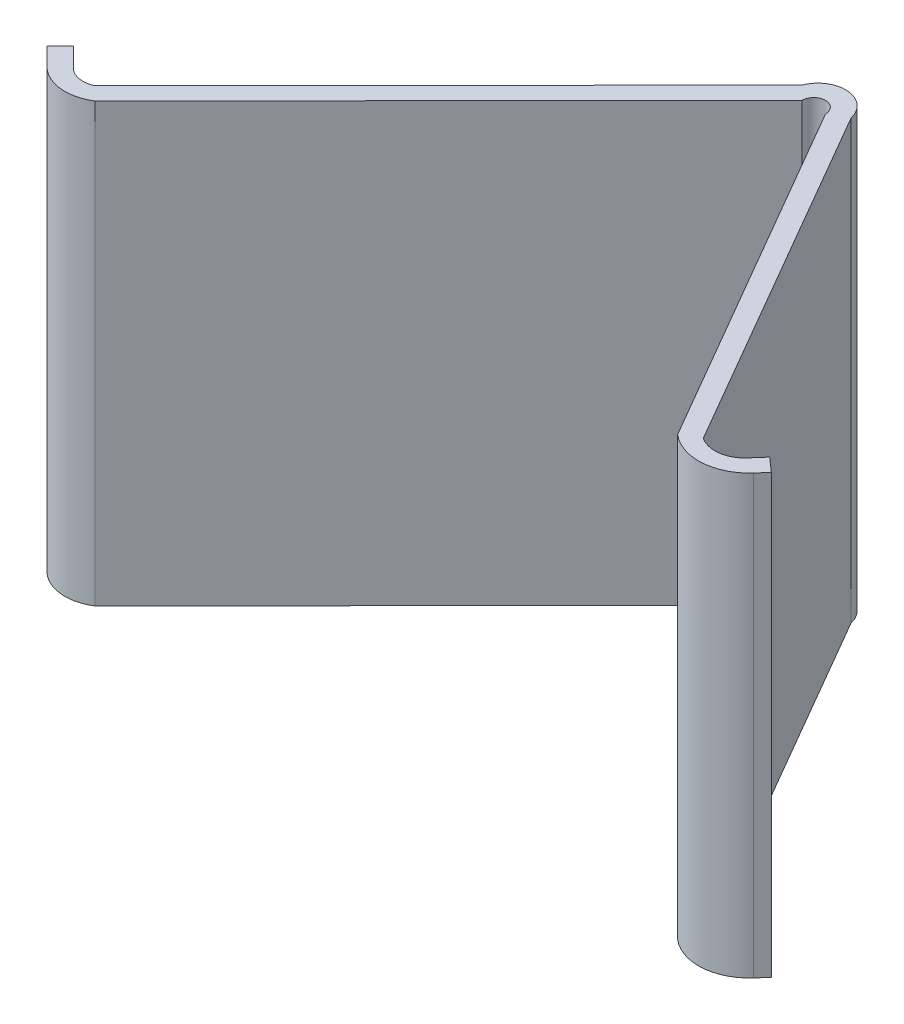
ISO-10303-21;
HEADER;
FILE_DESCRIPTION(('STEP AP214'),'2;1');
FILE_NAME('part.step','',(''),(''),'','','');
FILE_SCHEMA(('AUTOMOTIVE_DESIGN { 1 0 10303 214 1 1 1 1 }'));
ENDSEC;
DATA;
#1=APPLICATION_CONTEXT('core data for automotive mechanical design processes');
#2=APPLICATION_PROTOCOL_DEFINITION('international standard','automotive_design',2000,#1);
#3=PRODUCT_CONTEXT('',#1,'mechanical');
#4=PRODUCT('Part','Part','',(#3));
#5=PRODUCT_RELATED_PRODUCT_CATEGORY('part','',(#4));
#6=PRODUCT_DEFINITION_FORMATION('','',#4);
#7=PRODUCT_DEFINITION_CONTEXT('part definition',#1,'design');
#8=PRODUCT_DEFINITION('design','',#6,#7);
#9=PRODUCT_DEFINITION_SHAPE('','',#8);
#10=(LENGTH_UNIT() NAMED_UNIT(*) SI_UNIT(.MILLI.,.METRE.));
#11=(NAMED_UNIT(*) PLANE_ANGLE_UNIT() SI_UNIT($,.RADIAN.));
#12=(NAMED_UNIT(*) SI_UNIT($,.STERADIAN.) SOLID_ANGLE_UNIT());
#13=UNCERTAINTY_MEASURE_WITH_UNIT(LENGTH_MEASURE(1.E-05),#10,'distance_accuracy_value','');
#14=(GEOMETRIC_REPRESENTATION_CONTEXT(3) GLOBAL_UNCERTAINTY_ASSIGNED_CONTEXT((#13)) GLOBAL_UNIT_ASSIGNED_CONTEXT((#10,
#11,#12)) REPRESENTATION_CONTEXT('',''));
#15=CARTESIAN_POINT('',(0.,0.,0.));
#16=DIRECTION('',(0.,0.,1.));
#17=DIRECTION('',(1.,0.,0.));
#18=AXIS2_PLACEMENT_3D('',#15,#16,#17);
#19=CARTESIAN_POINT('',(-1.37972752963532,70.,-1.37563338266311));
#20=DIRECTION('',(-0.708156678158469,0.,-0.7060553230304));
#21=DIRECTION('',(-0.7060553230304,0.,0.708156678158469));
#22=AXIS2_PLACEMENT_3D('',#19,#20,#21);
#23=PLANE('',#22);
#24=DIRECTION('',(0.7060553230304,0.,-0.708156678158469));
#25=VECTOR('',#24,1.);
#26=CARTESIAN_POINT('',(-1.37972752963532,0.,-1.37563338266311));
#27=LINE('',#26,#25);
#28=CARTESIAN_POINT('',(-43.3633685392197,0.,40.73295893945));
#29=VERTEX_POINT('',#28);
#30=CARTESIAN_POINT('',(13.1210573032123,0.,-15.9195753132276));
#31=VERTEX_POINT('',#30);
#32=EDGE_CURVE('E478',#29,#31,#27,.T.);
#33=ORIENTED_EDGE('',*,*,#32,.T.);
#34=DIRECTION('',(0.,-1.,0.));
#35=VECTOR('',#34,1.);
#36=CARTESIAN_POINT('',(13.1210573032123,70.,-15.9195753132276));
#37=LINE('',#36,#35);
#38=CARTESIAN_POINT('',(13.1210573032123,70.,-15.9195753132276));
#39=VERTEX_POINT('',#38);
#40=EDGE_CURVE('E457',#39,#31,#37,.T.);
#41=ORIENTED_EDGE('',*,*,#40,.F.);
#42=DIRECTION('',(0.7060553230304,0.,-0.708156678158469));
#43=VECTOR('',#42,1.);
#44=CARTESIAN_POINT('',(-1.37972752963532,70.,-1.37563338266311));
#45=LINE('',#44,#43);
#46=CARTESIAN_POINT('',(-43.3633685392197,70.,40.73295893945));
#47=VERTEX_POINT('',#46);
#48=EDGE_CURVE('E477',#47,#39,#45,.T.);
#49=ORIENTED_EDGE('',*,*,#48,.F.);
#50=DIRECTION('',(0.,-1.,0.));
#51=VECTOR('',#50,1.);
#52=CARTESIAN_POINT('',(-43.3633685392197,70.,40.73295893945));
#53=LINE('',#52,#51);
#54=EDGE_CURVE('E282',#47,#29,#53,.T.);
#55=ORIENTED_EDGE('',*,*,#54,.T.);
#56=EDGE_LOOP('',(#33,#41,#49,#55));
#57=FACE_BOUND('',#56,.T.);
#58=ADVANCED_FACE('F263',(#57),#23,.F.);
#59=CARTESIAN_POINT('',(-3.50419756411074,70.,-3.49379935175431));
#60=DIRECTION('',(-0.708156678158469,0.,-0.7060553230304));
#61=DIRECTION('',(-0.7060553230304,0.,0.708156678158469));
#62=AXIS2_PLACEMENT_3D('',#59,#60,#61);
#63=PLANE('',#62);
#64=DIRECTION('',(0.7060553230304,0.,-0.708156678158469));
#65=VECTOR('',#64,1.);
#66=CARTESIAN_POINT('',(-3.50419756411074,0.,-3.49379935175431));
#67=LINE('',#66,#65);
#68=CARTESIAN_POINT('',(-45.4878385736951,0.,38.6147929703588));
#69=VERTEX_POINT('',#68);
#70=CARTESIAN_POINT('',(10.9965872687369,0.,-18.0377412823188));
#71=VERTEX_POINT('',#70);
#72=EDGE_CURVE('E454',#69,#71,#67,.T.);
#73=ORIENTED_EDGE('',*,*,#72,.F.);
#74=DIRECTION('',(0.,-1.,0.));
#75=VECTOR('',#74,1.);
#76=CARTESIAN_POINT('',(-45.4878385736951,70.,38.6147929703588));
#77=LINE('',#76,#75);
#78=CARTESIAN_POINT('',(-45.4878385736951,70.,38.6147929703588));
#79=VERTEX_POINT('',#78);
#80=EDGE_CURVE('E273',#79,#69,#77,.T.);
#81=ORIENTED_EDGE('',*,*,#80,.F.);
#82=DIRECTION('',(0.7060553230304,0.,-0.708156678158469));
#83=VECTOR('',#82,1.);
#84=CARTESIAN_POINT('',(-3.50419756411074,70.,-3.49379935175431));
#85=LINE('',#84,#83);
#86=CARTESIAN_POINT('',(10.9965872687369,70.,-18.0377412823188));
#87=VERTEX_POINT('',#86);
#88=EDGE_CURVE('E480',#79,#87,#85,.T.);
#89=ORIENTED_EDGE('',*,*,#88,.T.);
#90=DIRECTION('',(0.,-1.,0.));
#91=VECTOR('',#90,1.);
#92=CARTESIAN_POINT('',(10.9965872687369,70.,-18.0377412823188));
#93=LINE('',#92,#91);
#94=EDGE_CURVE('E12',#87,#71,#93,.T.);
#95=ORIENTED_EDGE('',*,*,#94,.T.);
#96=EDGE_LOOP('',(#73,#81,#89,#95));
#97=FACE_BOUND('',#96,.T.);
#98=ADVANCED_FACE('F499',(#97),#63,.T.);
#99=CARTESIAN_POINT('',(-47.1014105514273,70.,34.8767509581333));
#100=DIRECTION('',(0.,-1.,0.));
#101=DIRECTION('',(0.,0.,-1.));
#102=AXIS2_PLACEMENT_3D('',#99,#100,#101);
#103=CYLINDRICAL_SURFACE('',#102,6.94752689850618);
#104=CARTESIAN_POINT('',(-47.1014105514273,0.,34.8767509581333));
#105=DIRECTION('',(0.,1.,0.));
#106=DIRECTION('',(0.,0.,1.));
#107=AXIS2_PLACEMENT_3D('',#104,#105,#106);
#108=CIRCLE('',#107,6.94752689850618);
#109=CARTESIAN_POINT('',(-52.0067489000145,0.,39.7966885279961));
#110=VERTEX_POINT('',#109);
#111=EDGE_CURVE('E481',#29,#110,#108,.F.);
#112=ORIENTED_EDGE('',*,*,#111,.F.);
#113=ORIENTED_EDGE('',*,*,#54,.F.);
#114=CARTESIAN_POINT('',(-47.1014105514273,70.,34.8767509581333));
#115=DIRECTION('',(0.,1.,0.));
#116=DIRECTION('',(0.,0.,1.));
#117=AXIS2_PLACEMENT_3D('',#114,#115,#116);
#118=CIRCLE('',#117,6.94752689850618);
#119=CARTESIAN_POINT('',(-52.0067489000145,70.,39.7966885279961));
#120=VERTEX_POINT('',#119);
#121=EDGE_CURVE('E489',#47,#120,#118,.F.);
#122=ORIENTED_EDGE('',*,*,#121,.T.);
#123=DIRECTION('',(0.,-1.,0.));
#124=VECTOR('',#123,1.);
#125=CARTESIAN_POINT('',(-52.0067489000145,70.,39.7966885279961));
#126=LINE('',#125,#124);
#127=EDGE_CURVE('E474',#120,#110,#126,.T.);
#128=ORIENTED_EDGE('',*,*,#127,.T.);
#129=EDGE_LOOP('',(#112,#113,#122,#128));
#130=FACE_BOUND('',#129,.T.);
#131=ADVANCED_FACE('F526',(#130),#103,.T.);
#132=CARTESIAN_POINT('',(-47.0795581582017,70.,35.301794509272));
#133=DIRECTION('',(0.,-1.,0.));
#134=DIRECTION('',(0.,0.,-1.));
#135=AXIS2_PLACEMENT_3D('',#132,#133,#134);
#136=CYLINDRICAL_SURFACE('',#135,3.67553125940526);
#137=CARTESIAN_POINT('',(-47.0795581582017,0.,35.301794509272));
#138=DIRECTION('',(0.,1.,0.));
#139=DIRECTION('',(0.,0.,1.));
#140=AXIS2_PLACEMENT_3D('',#137,#138,#139);
#141=CIRCLE('',#140,3.67553125940526);
#142=CARTESIAN_POINT('',(-49.8885829309233,0.,37.6722184935206));
#143=VERTEX_POINT('',#142);
#144=EDGE_CURVE('E484',#143,#69,#141,.T.);
#145=ORIENTED_EDGE('',*,*,#144,.F.);
#146=DIRECTION('',(0.,-1.,0.));
#147=VECTOR('',#146,1.);
#148=CARTESIAN_POINT('',(-49.8885829309233,70.,37.6722184935206));
#149=LINE('',#148,#147);
#150=CARTESIAN_POINT('',(-49.8885829309233,70.,37.6722184935206));
#151=VERTEX_POINT('',#150);
#152=EDGE_CURVE('E472',#151,#143,#149,.T.);
#153=ORIENTED_EDGE('',*,*,#152,.F.);
#154=CARTESIAN_POINT('',(-47.0795581582017,70.,35.301794509272));
#155=DIRECTION('',(0.,1.,0.));
#156=DIRECTION('',(0.,0.,1.));
#157=AXIS2_PLACEMENT_3D('',#154,#155,#156);
#158=CIRCLE('',#157,3.67553125940526);
#159=EDGE_CURVE('E491',#151,#79,#158,.T.);
#160=ORIENTED_EDGE('',*,*,#159,.T.);
#161=ORIENTED_EDGE('',*,*,#80,.T.);
#162=EDGE_LOOP('',(#145,#153,#160,#161));
#163=FACE_BOUND('',#162,.T.);
#164=ADVANCED_FACE('F513',(#163),#136,.F.);
#165=CARTESIAN_POINT('',(0.,0.,0.));
#166=DIRECTION('',(0.,1.,0.));
#167=DIRECTION('',(0.,0.,1.));
#168=AXIS2_PLACEMENT_3D('',#165,#166,#167);
#169=PLANE('',#168);
#170=ORIENTED_EDGE('',*,*,#144,.T.);
#171=ORIENTED_EDGE('',*,*,#72,.T.);
#172=CARTESIAN_POINT('',(15.1528221863756,0.,-16.4480817857646));
#173=DIRECTION('',(0.,1.,0.));
#174=DIRECTION('',(0.,0.,1.));
#175=AXIS2_PLACEMENT_3D('',#172,#173,#174);
#176=CIRCLE('',#175,4.44986584130173);
#177=CARTESIAN_POINT('',(19.4944801510169,0.,-17.4234340932158));
#178=VERTEX_POINT('',#177);
#179=EDGE_CURVE('E461',#178,#71,#176,.T.);
#180=ORIENTED_EDGE('',*,*,#179,.F.);
#181=DIRECTION('',(0.501286259996058,0.,0.865281506527884));
#182=VECTOR('',#181,1.);
#183=CARTESIAN_POINT('',(22.1532324220866,0.,-12.83410190084));
#184=LINE('',#183,#182);
#185=CARTESIAN_POINT('',(52.0780870507607,0.,38.8198638310967));
#186=VERTEX_POINT('',#185);
#187=EDGE_CURVE('E432',#178,#186,#184,.T.);
#188=ORIENTED_EDGE('',*,*,#187,.T.);
#189=CARTESIAN_POINT('',(54.742084179433,0.,34.7879503258305));
#190=DIRECTION('',(0.,1.,0.));
#191=DIRECTION('',(0.,0.,1.));
#192=AXIS2_PLACEMENT_3D('',#189,#190,#191);
#193=CIRCLE('',#192,4.83251561979064);
#194=CARTESIAN_POINT('',(58.6689987900576,0.,37.6044284202566));
#195=VERTEX_POINT('',#194);
#196=EDGE_CURVE('E392',#186,#195,#193,.T.);
#197=ORIENTED_EDGE('',*,*,#196,.T.);
#198=DIRECTION('',(0.662657885771097,0.,-0.748922243243836));
#199=VECTOR('',#198,1.);
#200=CARTESIAN_POINT('',(58.6689987900576,0.,37.6044284202566));
#201=LINE('',#200,#199);
#202=CARTESIAN_POINT('',(59.9943145615998,0.,36.1065839337689));
#203=VERTEX_POINT('',#202);
#204=EDGE_CURVE('E376',#195,#203,#201,.T.);
#205=ORIENTED_EDGE('',*,*,#204,.T.);
#206=DIRECTION('',(0.748922243243836,0.,0.662657885771097));
#207=VECTOR('',#206,1.);
#208=CARTESIAN_POINT('',(59.9943145615998,0.,36.1065839337689));
#209=LINE('',#208,#207);
#210=CARTESIAN_POINT('',(62.2410812913313,0.,38.0945575910822));
#211=VERTEX_POINT('',#210);
#212=EDGE_CURVE('E383',#203,#211,#209,.T.);
#213=ORIENTED_EDGE('',*,*,#212,.T.);
#214=DIRECTION('',(0.662657885771111,0.,-0.748922243243824));
#215=VECTOR('',#214,1.);
#216=CARTESIAN_POINT('',(60.9157655197891,0.,39.5924020775699));
#217=LINE('',#216,#215);
#218=CARTESIAN_POINT('',(60.9157655197891,0.,39.5924020775699));
#219=VERTEX_POINT('',#218);
#220=EDGE_CURVE('E386',#219,#211,#217,.T.);
#221=ORIENTED_EDGE('',*,*,#220,.F.);
#222=CARTESIAN_POINT('',(54.8312610227236,0.,34.2087391908511));
#223=DIRECTION('',(0.,1.,0.));
#224=DIRECTION('',(0.,0.,1.));
#225=AXIS2_PLACEMENT_3D('',#222,#223,#224);
#226=CIRCLE('',#225,8.12434742318682);
#227=CARTESIAN_POINT('',(49.4822425311771,0.,40.3237226110849));
#228=VERTEX_POINT('',#227);
#229=EDGE_CURVE('E436',#228,#219,#226,.T.);
#230=ORIENTED_EDGE('',*,*,#229,.F.);
#231=DIRECTION('',(0.501286259996058,0.,0.865281506527884));
#232=VECTOR('',#231,1.);
#233=CARTESIAN_POINT('',(19.5573879025029,0.,-11.3302431208518));
#234=LINE('',#233,#232);
#235=CARTESIAN_POINT('',(16.8986356314333,0.,-15.9195753132276));
#236=VERTEX_POINT('',#235);
#237=EDGE_CURVE('E403',#236,#228,#234,.T.);
#238=ORIENTED_EDGE('',*,*,#237,.F.);
#239=CARTESIAN_POINT('',(15.0098464673228,0.,-15.9195753132276));
#240=DIRECTION('',(0.,1.,0.));
#241=DIRECTION('',(0.,0.,1.));
#242=AXIS2_PLACEMENT_3D('',#239,#240,#241);
#243=CIRCLE('',#242,1.88878916411049);
#244=EDGE_CURVE('E424',#236,#31,#243,.T.);
#245=ORIENTED_EDGE('',*,*,#244,.T.);
#246=ORIENTED_EDGE('',*,*,#32,.F.);
#247=ORIENTED_EDGE('',*,*,#111,.T.);
#248=DIRECTION('',(-0.708156678158472,0.,-0.706055323030397));
#249=VECTOR('',#248,1.);
#250=CARTESIAN_POINT('',(-52.0067489000145,0.,39.796688527996));
#251=LINE('',#250,#249);
#252=CARTESIAN_POINT('',(-54.8393756126484,0.,36.9724672358745));
#253=VERTEX_POINT('',#252);
#254=EDGE_CURVE('E407',#110,#253,#251,.T.);
#255=ORIENTED_EDGE('',*,*,#254,.T.);
#256=DIRECTION('',(0.706055323030396,0.,-0.708156678158473));
#257=VECTOR('',#256,1.);
#258=CARTESIAN_POINT('',(-54.8393756126484,0.,36.9724672358745));
#259=LINE('',#258,#257);
#260=CARTESIAN_POINT('',(-52.7212096435572,0.,34.847997201399));
#261=VERTEX_POINT('',#260);
#262=EDGE_CURVE('E411',#253,#261,#259,.T.);
#263=ORIENTED_EDGE('',*,*,#262,.T.);
#264=DIRECTION('',(-0.708156678158471,0.,-0.706055323030398));
#265=VECTOR('',#264,1.);
#266=CARTESIAN_POINT('',(-49.8885829309233,0.,37.6722184935206));
#267=LINE('',#266,#265);
#268=EDGE_CURVE('E381',#143,#261,#267,.T.);
#269=ORIENTED_EDGE('',*,*,#268,.F.);
#270=EDGE_LOOP('',(#170,#171,#180,#188,#197,#205,#213,#221,#230,#238,#245,#246,#247,#255,#263,#269));
#271=FACE_BOUND('',#270,.T.);
#272=ADVANCED_FACE('F389',(#271),#169,.F.);
#273=CARTESIAN_POINT('',(0.,70.,0.));
#274=DIRECTION('',(0.,1.,0.));
#275=DIRECTION('',(0.,0.,1.));
#276=AXIS2_PLACEMENT_3D('',#273,#274,#275);
#277=PLANE('',#276);
#278=ORIENTED_EDGE('',*,*,#121,.F.);
#279=ORIENTED_EDGE('',*,*,#48,.T.);
#280=CARTESIAN_POINT('',(15.0098464673228,70.,-15.9195753132276));
#281=DIRECTION('',(0.,1.,0.));
#282=DIRECTION('',(0.,0.,1.));
#283=AXIS2_PLACEMENT_3D('',#280,#281,#282);
#284=CIRCLE('',#283,1.88878916411049);
#285=CARTESIAN_POINT('',(16.8986356314333,70.,-15.9195753132276));
#286=VERTEX_POINT('',#285);
#287=EDGE_CURVE('E464',#286,#39,#284,.T.);
#288=ORIENTED_EDGE('',*,*,#287,.F.);
#289=DIRECTION('',(0.501286259996058,0.,0.865281506527884));
#290=VECTOR('',#289,1.);
#291=CARTESIAN_POINT('',(19.5573879025029,70.,-11.3302431208518));
#292=LINE('',#291,#290);
#293=CARTESIAN_POINT('',(49.4822425311771,70.,40.3237226110849));
#294=VERTEX_POINT('',#293);
#295=EDGE_CURVE('E434',#286,#294,#292,.T.);
#296=ORIENTED_EDGE('',*,*,#295,.T.);
#297=CARTESIAN_POINT('',(54.8312610227236,70.,34.2087391908511));
#298=DIRECTION('',(0.,1.,0.));
#299=DIRECTION('',(0.,0.,1.));
#300=AXIS2_PLACEMENT_3D('',#297,#298,#299);
#301=CIRCLE('',#300,8.12434742318682);
#302=CARTESIAN_POINT('',(60.9157655197891,70.,39.5924020775699));
#303=VERTEX_POINT('',#302);
#304=EDGE_CURVE('E446',#294,#303,#301,.T.);
#305=ORIENTED_EDGE('',*,*,#304,.T.);
#306=DIRECTION('',(0.662657885771111,0.,-0.748922243243824));
#307=VECTOR('',#306,1.);
#308=CARTESIAN_POINT('',(60.9157655197891,70.,39.5924020775699));
#309=LINE('',#308,#307);
#310=CARTESIAN_POINT('',(62.2410812913313,70.,38.0945575910822));
#311=VERTEX_POINT('',#310);
#312=EDGE_CURVE('E395',#303,#311,#309,.T.);
#313=ORIENTED_EDGE('',*,*,#312,.T.);
#314=DIRECTION('',(0.748922243243836,0.,0.662657885771097));
#315=VECTOR('',#314,1.);
#316=CARTESIAN_POINT('',(59.9943145615998,70.,36.1065839337689));
#317=LINE('',#316,#315);
#318=CARTESIAN_POINT('',(59.9943145615998,70.,36.1065839337689));
#319=VERTEX_POINT('',#318);
#320=EDGE_CURVE('E393',#319,#311,#317,.T.);
#321=ORIENTED_EDGE('',*,*,#320,.F.);
#322=DIRECTION('',(0.662657885771097,0.,-0.748922243243836));
#323=VECTOR('',#322,1.);
#324=CARTESIAN_POINT('',(58.6689987900576,70.,37.6044284202566));
#325=LINE('',#324,#323);
#326=CARTESIAN_POINT('',(58.6689987900576,70.,37.6044284202566));
#327=VERTEX_POINT('',#326);
#328=EDGE_CURVE('E379',#327,#319,#325,.T.);
#329=ORIENTED_EDGE('',*,*,#328,.F.);
#330=CARTESIAN_POINT('',(54.742084179433,70.,34.7879503258305));
#331=DIRECTION('',(0.,1.,0.));
#332=DIRECTION('',(0.,0.,1.));
#333=AXIS2_PLACEMENT_3D('',#330,#331,#332);
#334=CIRCLE('',#333,4.83251561979064);
#335=CARTESIAN_POINT('',(52.0780870507607,70.,38.8198638310967));
#336=VERTEX_POINT('',#335);
#337=EDGE_CURVE('E443',#336,#327,#334,.T.);
#338=ORIENTED_EDGE('',*,*,#337,.F.);
#339=DIRECTION('',(0.501286259996058,0.,0.865281506527884));
#340=VECTOR('',#339,1.);
#341=CARTESIAN_POINT('',(22.1532324220866,70.,-12.83410190084));
#342=LINE('',#341,#340);
#343=CARTESIAN_POINT('',(19.4944801510169,70.,-17.4234340932158));
#344=VERTEX_POINT('',#343);
#345=EDGE_CURVE('E431',#344,#336,#342,.T.);
#346=ORIENTED_EDGE('',*,*,#345,.F.);
#347=CARTESIAN_POINT('',(15.1528221863756,70.,-16.4480817857646));
#348=DIRECTION('',(0.,1.,0.));
#349=DIRECTION('',(0.,0.,1.));
#350=AXIS2_PLACEMENT_3D('',#347,#348,#349);
#351=CIRCLE('',#350,4.44986584130173);
#352=EDGE_CURVE('E460',#344,#87,#351,.T.);
#353=ORIENTED_EDGE('',*,*,#352,.T.);
#354=ORIENTED_EDGE('',*,*,#88,.F.);
#355=ORIENTED_EDGE('',*,*,#159,.F.);
#356=DIRECTION('',(-0.708156678158471,0.,-0.706055323030398));
#357=VECTOR('',#356,1.);
#358=CARTESIAN_POINT('',(-49.8885829309233,70.,37.6722184935206));
#359=LINE('',#358,#357);
#360=CARTESIAN_POINT('',(-52.7212096435572,70.,34.847997201399));
#361=VERTEX_POINT('',#360);
#362=EDGE_CURVE('E410',#151,#361,#359,.T.);
#363=ORIENTED_EDGE('',*,*,#362,.T.);
#364=DIRECTION('',(0.706055323030396,0.,-0.708156678158473));
#365=VECTOR('',#364,1.);
#366=CARTESIAN_POINT('',(-54.8393756126484,70.,36.9724672358745));
#367=LINE('',#366,#365);
#368=CARTESIAN_POINT('',(-54.8393756126484,70.,36.9724672358745));
#369=VERTEX_POINT('',#368);
#370=EDGE_CURVE('E418',#369,#361,#367,.T.);
#371=ORIENTED_EDGE('',*,*,#370,.F.);
#372=DIRECTION('',(-0.708156678158472,0.,-0.706055323030397));
#373=VECTOR('',#372,1.);
#374=CARTESIAN_POINT('',(-52.0067489000145,70.,39.796688527996));
#375=LINE('',#374,#373);
#376=EDGE_CURVE('E406',#120,#369,#375,.T.);
#377=ORIENTED_EDGE('',*,*,#376,.F.);
#378=EDGE_LOOP('',(#278,#279,#288,#296,#305,#313,#321,#329,#338,#346,#353,#354,#355,#363,#371,#377));
#379=FACE_BOUND('',#378,.T.);
#380=ADVANCED_FACE('F506',(#379),#277,.T.);
#381=CARTESIAN_POINT('',(-54.8393756126484,70.,36.9724672358745));
#382=DIRECTION('',(-0.708156678158473,0.,-0.706055323030396));
#383=DIRECTION('',(-0.706055323030396,0.,0.708156678158473));
#384=AXIS2_PLACEMENT_3D('',#381,#382,#383);
#385=PLANE('',#384);
#386=ORIENTED_EDGE('',*,*,#262,.F.);
#387=DIRECTION('',(0.,-1.,0.));
#388=VECTOR('',#387,1.);
#389=CARTESIAN_POINT('',(-54.8393756126484,70.,36.9724672358745));
#390=LINE('',#389,#388);
#391=EDGE_CURVE('E404',#369,#253,#390,.T.);
#392=ORIENTED_EDGE('',*,*,#391,.F.);
#393=ORIENTED_EDGE('',*,*,#370,.T.);
#394=DIRECTION('',(0.,-1.,0.));
#395=VECTOR('',#394,1.);
#396=CARTESIAN_POINT('',(-52.7212096435572,70.,34.847997201399));
#397=LINE('',#396,#395);
#398=EDGE_CURVE('E401',#361,#261,#397,.T.);
#399=ORIENTED_EDGE('',*,*,#398,.T.);
#400=EDGE_LOOP('',(#386,#392,#393,#399));
#401=FACE_BOUND('',#400,.T.);
#402=ADVANCED_FACE('F553',(#401),#385,.T.);
#403=CARTESIAN_POINT('',(-52.0067489000145,70.,39.796688527996));
#404=DIRECTION('',(-0.706055323030397,0.,0.708156678158472));
#405=DIRECTION('',(0.708156678158472,0.,0.706055323030397));
#406=AXIS2_PLACEMENT_3D('',#403,#404,#405);
#407=PLANE('',#406);
#408=ORIENTED_EDGE('',*,*,#254,.F.);
#409=ORIENTED_EDGE('',*,*,#127,.F.);
#410=ORIENTED_EDGE('',*,*,#376,.T.);
#411=ORIENTED_EDGE('',*,*,#391,.T.);
#412=EDGE_LOOP('',(#408,#409,#410,#411));
#413=FACE_BOUND('',#412,.T.);
#414=ADVANCED_FACE('F524',(#413),#407,.T.);
#415=CARTESIAN_POINT('',(-49.8885829309233,70.,37.6722184935206));
#416=DIRECTION('',(-0.706055323030398,0.,0.708156678158471));
#417=DIRECTION('',(0.708156678158471,0.,0.706055323030398));
#418=AXIS2_PLACEMENT_3D('',#415,#416,#417);
#419=PLANE('',#418);
#420=ORIENTED_EDGE('',*,*,#268,.T.);
#421=ORIENTED_EDGE('',*,*,#398,.F.);
#422=ORIENTED_EDGE('',*,*,#362,.F.);
#423=ORIENTED_EDGE('',*,*,#152,.T.);
#424=EDGE_LOOP('',(#420,#421,#422,#423));
#425=FACE_BOUND('',#424,.T.);
#426=ADVANCED_FACE('F518',(#425),#419,.F.);
#427=CARTESIAN_POINT('',(60.9157655197891,70.,39.5924020775699));
#428=DIRECTION('',(-0.748922243243824,0.,-0.662657885771111));
#429=DIRECTION('',(-0.662657885771111,0.,0.748922243243824));
#430=AXIS2_PLACEMENT_3D('',#427,#428,#429);
#431=PLANE('',#430);
#432=ORIENTED_EDGE('',*,*,#220,.T.);
#433=DIRECTION('',(0.,-1.,0.));
#434=VECTOR('',#433,1.);
#435=CARTESIAN_POINT('',(62.2410812913313,70.,38.0945575910822));
#436=LINE('',#435,#434);
#437=EDGE_CURVE('E267',#311,#211,#436,.T.);
#438=ORIENTED_EDGE('',*,*,#437,.F.);
#439=ORIENTED_EDGE('',*,*,#312,.F.);
#440=DIRECTION('',(0.,-1.,0.));
#441=VECTOR('',#440,1.);
#442=CARTESIAN_POINT('',(60.9157655197891,70.,39.5924020775699));
#443=LINE('',#442,#441);
#444=EDGE_CURVE('E425',#303,#219,#443,.T.);
#445=ORIENTED_EDGE('',*,*,#444,.T.);
#446=EDGE_LOOP('',(#432,#438,#439,#445));
#447=FACE_BOUND('',#446,.T.);
#448=ADVANCED_FACE('F543',(#447),#431,.F.);
#449=CARTESIAN_POINT('',(59.9943145615998,70.,36.1065839337689));
#450=DIRECTION('',(0.662657885771097,0.,-0.748922243243836));
#451=DIRECTION('',(-0.748922243243836,0.,-0.662657885771097));
#452=AXIS2_PLACEMENT_3D('',#449,#450,#451);
#453=PLANE('',#452);
#454=ORIENTED_EDGE('',*,*,#212,.F.);
#455=DIRECTION('',(0.,-1.,0.));
#456=VECTOR('',#455,1.);
#457=CARTESIAN_POINT('',(59.9943145615998,70.,36.1065839337689));
#458=LINE('',#457,#456);
#459=EDGE_CURVE('E373',#319,#203,#458,.T.);
#460=ORIENTED_EDGE('',*,*,#459,.F.);
#461=ORIENTED_EDGE('',*,*,#320,.T.);
#462=ORIENTED_EDGE('',*,*,#437,.T.);
#463=EDGE_LOOP('',(#454,#460,#461,#462));
#464=FACE_BOUND('',#463,.T.);
#465=ADVANCED_FACE('F265',(#464),#453,.T.);
#466=CARTESIAN_POINT('',(54.8312610227236,70.,34.2087391908511));
#467=DIRECTION('',(0.,-1.,0.));
#468=DIRECTION('',(0.,0.,-1.));
#469=AXIS2_PLACEMENT_3D('',#466,#467,#468);
#470=CYLINDRICAL_SURFACE('',#469,8.12434742318682);
#471=ORIENTED_EDGE('',*,*,#229,.T.);
#472=ORIENTED_EDGE('',*,*,#444,.F.);
#473=ORIENTED_EDGE('',*,*,#304,.F.);
#474=DIRECTION('',(0.,-1.,0.));
#475=VECTOR('',#474,1.);
#476=CARTESIAN_POINT('',(49.4822425311771,70.,40.3237226110849));
#477=LINE('',#476,#475);
#478=EDGE_CURVE('E422',#294,#228,#477,.T.);
#479=ORIENTED_EDGE('',*,*,#478,.T.);
#480=EDGE_LOOP('',(#471,#472,#473,#479));
#481=FACE_BOUND('',#480,.T.);
#482=ADVANCED_FACE('F540',(#481),#470,.T.);
#483=CARTESIAN_POINT('',(58.6689987900576,70.,37.6044284202566));
#484=DIRECTION('',(-0.748922243243836,0.,-0.662657885771098));
#485=DIRECTION('',(-0.662657885771098,0.,0.748922243243836));
#486=AXIS2_PLACEMENT_3D('',#483,#484,#485);
#487=PLANE('',#486);
#488=ORIENTED_EDGE('',*,*,#204,.F.);
#489=DIRECTION('',(0.,-1.,0.));
#490=VECTOR('',#489,1.);
#491=CARTESIAN_POINT('',(58.6689987900576,70.,37.6044284202566));
#492=LINE('',#491,#490);
#493=EDGE_CURVE('E427',#327,#195,#492,.T.);
#494=ORIENTED_EDGE('',*,*,#493,.F.);
#495=ORIENTED_EDGE('',*,*,#328,.T.);
#496=ORIENTED_EDGE('',*,*,#459,.T.);
#497=EDGE_LOOP('',(#488,#494,#495,#496));
#498=FACE_BOUND('',#497,.T.);
#499=ADVANCED_FACE('F374',(#498),#487,.T.);
#500=CARTESIAN_POINT('',(19.5573879025029,70.,-11.3302431208518));
#501=DIRECTION('',(0.865281506527884,0.,-0.501286259996058));
#502=DIRECTION('',(-0.501286259996058,0.,-0.865281506527884));
#503=AXIS2_PLACEMENT_3D('',#500,#501,#502);
#504=PLANE('',#503);
#505=ORIENTED_EDGE('',*,*,#237,.T.);
#506=ORIENTED_EDGE('',*,*,#478,.F.);
#507=ORIENTED_EDGE('',*,*,#295,.F.);
#508=DIRECTION('',(0.,-1.,0.));
#509=VECTOR('',#508,1.);
#510=CARTESIAN_POINT('',(16.8986356314333,70.,-15.9195753132276));
#511=LINE('',#510,#509);
#512=EDGE_CURVE('E451',#286,#236,#511,.T.);
#513=ORIENTED_EDGE('',*,*,#512,.T.);
#514=EDGE_LOOP('',(#505,#506,#507,#513));
#515=FACE_BOUND('',#514,.T.);
#516=ADVANCED_FACE('F536',(#515),#504,.F.);
#517=CARTESIAN_POINT('',(54.742084179433,70.,34.7879503258305));
#518=DIRECTION('',(0.,-1.,0.));
#519=DIRECTION('',(0.,0.,-1.));
#520=AXIS2_PLACEMENT_3D('',#517,#518,#519);
#521=CYLINDRICAL_SURFACE('',#520,4.83251561979064);
#522=ORIENTED_EDGE('',*,*,#196,.F.);
#523=DIRECTION('',(0.,-1.,0.));
#524=VECTOR('',#523,1.);
#525=CARTESIAN_POINT('',(52.0780870507607,70.,38.8198638310967));
#526=LINE('',#525,#524);
#527=EDGE_CURVE('E429',#336,#186,#526,.T.);
#528=ORIENTED_EDGE('',*,*,#527,.F.);
#529=ORIENTED_EDGE('',*,*,#337,.T.);
#530=ORIENTED_EDGE('',*,*,#493,.T.);
#531=EDGE_LOOP('',(#522,#528,#529,#530));
#532=FACE_BOUND('',#531,.T.);
#533=ADVANCED_FACE('F546',(#532),#521,.F.);
#534=CARTESIAN_POINT('',(22.1532324220866,70.,-12.83410190084));
#535=DIRECTION('',(0.865281506527884,0.,-0.501286259996058));
#536=DIRECTION('',(-0.501286259996058,0.,-0.865281506527884));
#537=AXIS2_PLACEMENT_3D('',#534,#535,#536);
#538=PLANE('',#537);
#539=ORIENTED_EDGE('',*,*,#187,.F.);
#540=DIRECTION('',(0.,-1.,0.));
#541=VECTOR('',#540,1.);
#542=CARTESIAN_POINT('',(19.4944801510169,70.,-17.4234340932158));
#543=LINE('',#542,#541);
#544=EDGE_CURVE('E455',#344,#178,#543,.T.);
#545=ORIENTED_EDGE('',*,*,#544,.F.);
#546=ORIENTED_EDGE('',*,*,#345,.T.);
#547=ORIENTED_EDGE('',*,*,#527,.T.);
#548=EDGE_LOOP('',(#539,#545,#546,#547));
#549=FACE_BOUND('',#548,.T.);
#550=ADVANCED_FACE('F549',(#549),#538,.T.);
#551=CARTESIAN_POINT('',(15.0098464673228,70.,-15.9195753132276));
#552=DIRECTION('',(0.,-1.,0.));
#553=DIRECTION('',(0.,0.,-1.));
#554=AXIS2_PLACEMENT_3D('',#551,#552,#553);
#555=CYLINDRICAL_SURFACE('',#554,1.88878916411049);
#556=ORIENTED_EDGE('',*,*,#244,.F.);
#557=ORIENTED_EDGE('',*,*,#512,.F.);
#558=ORIENTED_EDGE('',*,*,#287,.T.);
#559=ORIENTED_EDGE('',*,*,#40,.T.);
#560=EDGE_LOOP('',(#556,#557,#558,#559));
#561=FACE_BOUND('',#560,.T.);
#562=ADVANCED_FACE('F534',(#561),#555,.F.);
#563=CARTESIAN_POINT('',(15.1528221863756,70.,-16.4480817857646));
#564=DIRECTION('',(0.,-1.,0.));
#565=DIRECTION('',(0.,0.,-1.));
#566=AXIS2_PLACEMENT_3D('',#563,#564,#565);
#567=CYLINDRICAL_SURFACE('',#566,4.44986584130173);
#568=ORIENTED_EDGE('',*,*,#179,.T.);
#569=ORIENTED_EDGE('',*,*,#94,.F.);
#570=ORIENTED_EDGE('',*,*,#352,.F.);
#571=ORIENTED_EDGE('',*,*,#544,.T.);
#572=EDGE_LOOP('',(#568,#569,#570,#571));
#573=FACE_BOUND('',#572,.T.);
#574=ADVANCED_FACE('F552',(#573),#567,.T.);
#575=CLOSED_SHELL('',(#58,#98,#131,#164,#272,#380,#402,#414,#426,#448,#465,#482,#499,#516,#533,
#550,#562,#574));
#576=MANIFOLD_SOLID_BREP('B2',#575);
#577=ADVANCED_BREP_SHAPE_REPRESENTATION('',(#18,#576),#14);
#578=SHAPE_DEFINITION_REPRESENTATION(#9,#577);
ENDSEC;
END-ISO-10303-21;
